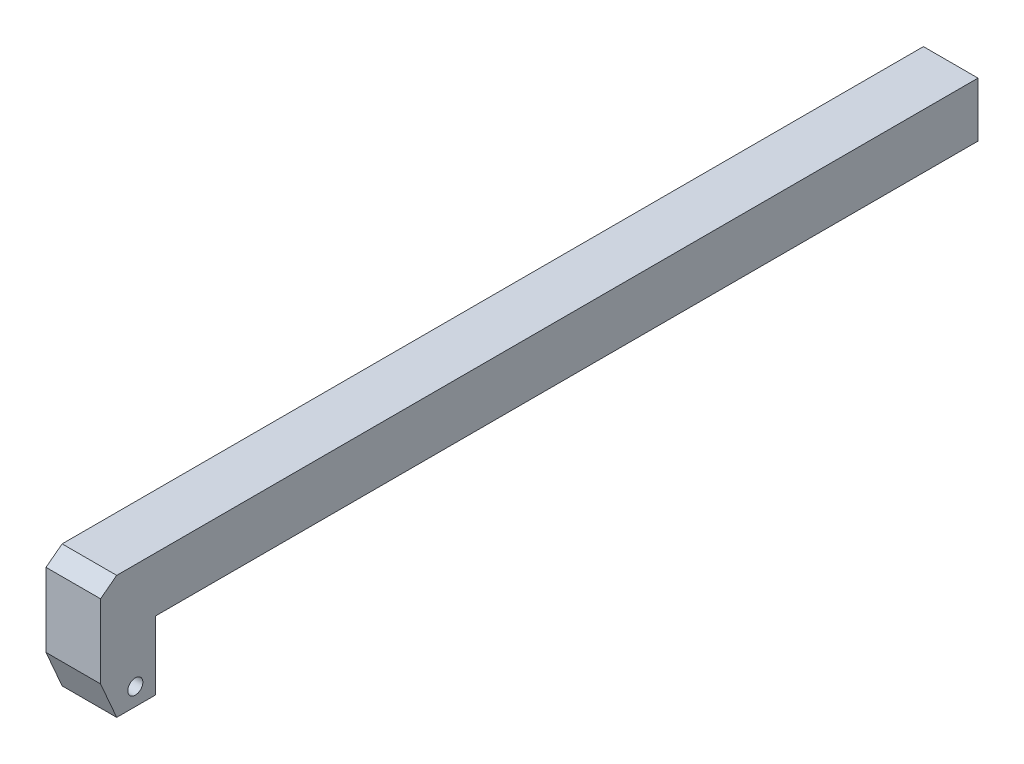
ISO-10303-21;
HEADER;
FILE_DESCRIPTION(('STEP AP214'),'2;1');
FILE_NAME('part.step','',(''),(''),'','','');
FILE_SCHEMA(('AUTOMOTIVE_DESIGN { 1 0 10303 214 1 1 1 1 }'));
ENDSEC;
DATA;
#1=APPLICATION_CONTEXT('core data for automotive mechanical design processes');
#2=APPLICATION_PROTOCOL_DEFINITION('international standard','automotive_design',2000,#1);
#3=PRODUCT_CONTEXT('',#1,'mechanical');
#4=PRODUCT('Part','Part','',(#3));
#5=PRODUCT_RELATED_PRODUCT_CATEGORY('part','',(#4));
#6=PRODUCT_DEFINITION_FORMATION('','',#4);
#7=PRODUCT_DEFINITION_CONTEXT('part definition',#1,'design');
#8=PRODUCT_DEFINITION('design','',#6,#7);
#9=PRODUCT_DEFINITION_SHAPE('','',#8);
#10=(LENGTH_UNIT() NAMED_UNIT(*) SI_UNIT(.MILLI.,.METRE.));
#11=(NAMED_UNIT(*) PLANE_ANGLE_UNIT() SI_UNIT($,.RADIAN.));
#12=(NAMED_UNIT(*) SI_UNIT($,.STERADIAN.) SOLID_ANGLE_UNIT());
#13=UNCERTAINTY_MEASURE_WITH_UNIT(LENGTH_MEASURE(1.E-05),#10,'distance_accuracy_value','');
#14=(GEOMETRIC_REPRESENTATION_CONTEXT(3) GLOBAL_UNCERTAINTY_ASSIGNED_CONTEXT((#13)) GLOBAL_UNIT_ASSIGNED_CONTEXT((#10,
#11,#12)) REPRESENTATION_CONTEXT('',''));
#15=CARTESIAN_POINT('',(0.,0.,0.));
#16=DIRECTION('',(0.,0.,1.));
#17=DIRECTION('',(1.,0.,0.));
#18=AXIS2_PLACEMENT_3D('',#15,#16,#17);
#19=CARTESIAN_POINT('',(0.,0.,11099.8));
#20=DIRECTION('',(1.,0.,0.));
#21=DIRECTION('',(0.,0.,-1.));
#22=AXIS2_PLACEMENT_3D('',#19,#20,#21);
#23=PLANE('',#22);
#24=DIRECTION('',(0.,-1.,0.));
#25=VECTOR('',#24,1.);
#26=CARTESIAN_POINT('',(0.,0.,0.));
#27=LINE('',#26,#25);
#28=CARTESIAN_POINT('',(0.,736.6,0.));
#29=VERTEX_POINT('',#28);
#30=CARTESIAN_POINT('',(0.,0.,0.));
#31=VERTEX_POINT('',#30);
#32=EDGE_CURVE('E115',#29,#31,#27,.T.);
#33=ORIENTED_EDGE('',*,*,#32,.T.);
#34=DIRECTION('',(0.,0.,-1.));
#35=VECTOR('',#34,1.);
#36=CARTESIAN_POINT('',(0.,0.,11099.8));
#37=LINE('',#36,#35);
#38=CARTESIAN_POINT('',(0.,0.,11099.8));
#39=VERTEX_POINT('',#38);
#40=EDGE_CURVE('E12',#39,#31,#37,.T.);
#41=ORIENTED_EDGE('',*,*,#40,.F.);
#42=DIRECTION('',(0.,1.,0.));
#43=VECTOR('',#42,1.);
#44=CARTESIAN_POINT('',(0.,-923.87759113299,11099.8));
#45=LINE('',#44,#43);
#46=CARTESIAN_POINT('',(0.,-923.87759113299,11099.8));
#47=VERTEX_POINT('',#46);
#48=EDGE_CURVE('E150',#47,#39,#45,.T.);
#49=ORIENTED_EDGE('',*,*,#48,.F.);
#50=DIRECTION('',(0.,0.,-1.));
#51=VECTOR('',#50,1.);
#52=CARTESIAN_POINT('',(0.,-923.87759113299,11625.8192032053));
#53=LINE('',#52,#51);
#54=CARTESIAN_POINT('',(0.,-923.87759113299,11625.8192032053));
#55=VERTEX_POINT('',#54);
#56=EDGE_CURVE('E135',#55,#47,#53,.T.);
#57=ORIENTED_EDGE('',*,*,#56,.F.);
#58=DIRECTION('',(0.,-0.916925737569036,-0.399057880242303));
#59=VECTOR('',#58,1.);
#60=CARTESIAN_POINT('',(0.,-423.598720109949,11843.5470056005));
#61=LINE('',#60,#59);
#62=CARTESIAN_POINT('',(0.,-423.598720109949,11843.5470056005));
#63=VERTEX_POINT('',#62);
#64=EDGE_CURVE('E140',#63,#55,#61,.T.);
#65=ORIENTED_EDGE('',*,*,#64,.F.);
#66=DIRECTION('',(0.,-1.,0.));
#67=VECTOR('',#66,1.);
#68=CARTESIAN_POINT('',(0.,571.270728239262,11843.5470056005));
#69=LINE('',#68,#67);
#70=CARTESIAN_POINT('',(0.,571.270728239262,11843.5470056005));
#71=VERTEX_POINT('',#70);
#72=EDGE_CURVE('E158',#71,#63,#69,.T.);
#73=ORIENTED_EDGE('',*,*,#72,.F.);
#74=DIRECTION('',(0.,-0.604749662713381,0.796415623558486));
#75=VECTOR('',#74,1.);
#76=CARTESIAN_POINT('',(0.,736.6,11625.8192032053));
#77=LINE('',#76,#75);
#78=CARTESIAN_POINT('',(0.,736.6,11625.8192032053));
#79=VERTEX_POINT('',#78);
#80=EDGE_CURVE('E126',#79,#71,#77,.T.);
#81=ORIENTED_EDGE('',*,*,#80,.F.);
#82=DIRECTION('',(0.,0.,-1.));
#83=VECTOR('',#82,1.);
#84=CARTESIAN_POINT('',(0.,736.6,11099.8));
#85=LINE('',#84,#83);
#86=EDGE_CURVE('E110',#79,#29,#85,.T.);
#87=ORIENTED_EDGE('',*,*,#86,.T.);
#88=EDGE_LOOP('',(#33,#41,#49,#57,#65,#73,#81,#87));
#89=FACE_BOUND('',#88,.T.);
#90=CARTESIAN_POINT('',(0.,-687.797576452867,11374.533737558));
#91=DIRECTION('',(1.,0.,0.));
#92=DIRECTION('',(0.,0.,-1.));
#93=AXIS2_PLACEMENT_3D('',#90,#91,#92);
#94=CIRCLE('',#93,101.599999999999);
#95=CARTESIAN_POINT('',(0.,-687.797576452867,11272.933737558));
#96=VERTEX_POINT('',#95);
#97=EDGE_CURVE('E173',#96,#96,#94,.T.);
#98=ORIENTED_EDGE('',*,*,#97,.T.);
#99=EDGE_LOOP('',(#98));
#100=FACE_BOUND('',#99,.T.);
#101=ADVANCED_FACE('F57',(#89,#100),#23,.F.);
#102=CARTESIAN_POINT('',(0.,0.,11099.8));
#103=DIRECTION('',(0.,1.,0.));
#104=DIRECTION('',(0.,0.,1.));
#105=AXIS2_PLACEMENT_3D('',#102,#103,#104);
#106=PLANE('',#105);
#107=DIRECTION('',(1.,0.,0.));
#108=VECTOR('',#107,1.);
#109=CARTESIAN_POINT('',(0.,0.,0.));
#110=LINE('',#109,#108);
#111=CARTESIAN_POINT('',(736.6,0.,0.));
#112=VERTEX_POINT('',#111);
#113=EDGE_CURVE('E101',#31,#112,#110,.T.);
#114=ORIENTED_EDGE('',*,*,#113,.T.);
#115=DIRECTION('',(0.,0.,-1.));
#116=VECTOR('',#115,1.);
#117=CARTESIAN_POINT('',(736.6,0.,11099.8));
#118=LINE('',#117,#116);
#119=CARTESIAN_POINT('',(736.6,0.,11099.8));
#120=VERTEX_POINT('',#119);
#121=EDGE_CURVE('E65',#120,#112,#118,.T.);
#122=ORIENTED_EDGE('',*,*,#121,.F.);
#123=DIRECTION('',(1.,0.,0.));
#124=VECTOR('',#123,1.);
#125=CARTESIAN_POINT('',(0.,0.,11099.8));
#126=LINE('',#125,#124);
#127=EDGE_CURVE('E71',#39,#120,#126,.T.);
#128=ORIENTED_EDGE('',*,*,#127,.F.);
#129=ORIENTED_EDGE('',*,*,#40,.T.);
#130=EDGE_LOOP('',(#114,#122,#128,#129));
#131=FACE_BOUND('',#130,.T.);
#132=ADVANCED_FACE('F145',(#131),#106,.F.);
#133=CARTESIAN_POINT('',(736.6,0.,11099.8));
#134=DIRECTION('',(-1.,0.,0.));
#135=DIRECTION('',(0.,0.,1.));
#136=AXIS2_PLACEMENT_3D('',#133,#134,#135);
#137=PLANE('',#136);
#138=DIRECTION('',(0.,1.,0.));
#139=VECTOR('',#138,1.);
#140=CARTESIAN_POINT('',(736.6,0.,0.));
#141=LINE('',#140,#139);
#142=CARTESIAN_POINT('',(736.6,736.6,0.));
#143=VERTEX_POINT('',#142);
#144=EDGE_CURVE('E89',#112,#143,#141,.T.);
#145=ORIENTED_EDGE('',*,*,#144,.T.);
#146=DIRECTION('',(0.,0.,-1.));
#147=VECTOR('',#146,1.);
#148=CARTESIAN_POINT('',(736.6,736.6,11099.8));
#149=LINE('',#148,#147);
#150=CARTESIAN_POINT('',(736.6,736.6,11625.8192032053));
#151=VERTEX_POINT('',#150);
#152=EDGE_CURVE('E95',#151,#143,#149,.T.);
#153=ORIENTED_EDGE('',*,*,#152,.F.);
#154=DIRECTION('',(0.,-0.604749662713381,0.796415623558486));
#155=VECTOR('',#154,1.);
#156=CARTESIAN_POINT('',(736.6,736.6,11625.8192032053));
#157=LINE('',#156,#155);
#158=CARTESIAN_POINT('',(736.6,571.270728239262,11843.5470056005));
#159=VERTEX_POINT('',#158);
#160=EDGE_CURVE('E133',#151,#159,#157,.T.);
#161=ORIENTED_EDGE('',*,*,#160,.T.);
#162=DIRECTION('',(0.,-1.,0.));
#163=VECTOR('',#162,1.);
#164=CARTESIAN_POINT('',(736.6,571.270728239262,11843.5470056005));
#165=LINE('',#164,#163);
#166=CARTESIAN_POINT('',(736.6,-423.598720109949,11843.5470056005));
#167=VERTEX_POINT('',#166);
#168=EDGE_CURVE('E175',#159,#167,#165,.T.);
#169=ORIENTED_EDGE('',*,*,#168,.T.);
#170=DIRECTION('',(0.,-0.916925737569036,-0.399057880242303));
#171=VECTOR('',#170,1.);
#172=CARTESIAN_POINT('',(736.6,-423.598720109949,11843.5470056005));
#173=LINE('',#172,#171);
#174=CARTESIAN_POINT('',(736.6,-923.87759113299,11625.8192032053));
#175=VERTEX_POINT('',#174);
#176=EDGE_CURVE('E161',#167,#175,#173,.T.);
#177=ORIENTED_EDGE('',*,*,#176,.T.);
#178=DIRECTION('',(0.,0.,-1.));
#179=VECTOR('',#178,1.);
#180=CARTESIAN_POINT('',(736.6,-923.87759113299,11625.8192032053));
#181=LINE('',#180,#179);
#182=CARTESIAN_POINT('',(736.6,-923.87759113299,11099.8));
#183=VERTEX_POINT('',#182);
#184=EDGE_CURVE('E156',#175,#183,#181,.T.);
#185=ORIENTED_EDGE('',*,*,#184,.T.);
#186=DIRECTION('',(0.,1.,0.));
#187=VECTOR('',#186,1.);
#188=CARTESIAN_POINT('',(736.6,0.,11099.8));
#189=LINE('',#188,#187);
#190=EDGE_CURVE('E171',#183,#120,#189,.T.);
#191=ORIENTED_EDGE('',*,*,#190,.T.);
#192=ORIENTED_EDGE('',*,*,#121,.T.);
#193=EDGE_LOOP('',(#145,#153,#161,#169,#177,#185,#191,#192));
#194=FACE_BOUND('',#193,.T.);
#195=CARTESIAN_POINT('',(736.6,-687.797576452867,11374.533737558));
#196=DIRECTION('',(1.,0.,0.));
#197=DIRECTION('',(0.,0.,-1.));
#198=AXIS2_PLACEMENT_3D('',#195,#196,#197);
#199=CIRCLE('',#198,101.599999999999);
#200=CARTESIAN_POINT('',(736.6,-687.797576452867,11272.933737558));
#201=VERTEX_POINT('',#200);
#202=EDGE_CURVE('E164',#201,#201,#199,.T.);
#203=ORIENTED_EDGE('',*,*,#202,.F.);
#204=EDGE_LOOP('',(#203));
#205=FACE_BOUND('',#204,.T.);
#206=ADVANCED_FACE('F91',(#194,#205),#137,.F.);
#207=CARTESIAN_POINT('',(0.,736.6,11099.8));
#208=DIRECTION('',(0.,-1.,0.));
#209=DIRECTION('',(0.,0.,-1.));
#210=AXIS2_PLACEMENT_3D('',#207,#208,#209);
#211=PLANE('',#210);
#212=DIRECTION('',(-1.,0.,0.));
#213=VECTOR('',#212,1.);
#214=CARTESIAN_POINT('',(0.,736.6,0.));
#215=LINE('',#214,#213);
#216=EDGE_CURVE('E100',#143,#29,#215,.T.);
#217=ORIENTED_EDGE('',*,*,#216,.T.);
#218=ORIENTED_EDGE('',*,*,#86,.F.);
#219=DIRECTION('',(1.,0.,0.));
#220=VECTOR('',#219,1.);
#221=CARTESIAN_POINT('',(0.,736.6,11625.8192032053));
#222=LINE('',#221,#220);
#223=EDGE_CURVE('E108',#79,#151,#222,.T.);
#224=ORIENTED_EDGE('',*,*,#223,.T.);
#225=ORIENTED_EDGE('',*,*,#152,.T.);
#226=EDGE_LOOP('',(#217,#218,#224,#225));
#227=FACE_BOUND('',#226,.T.);
#228=ADVANCED_FACE('F104',(#227),#211,.F.);
#229=CARTESIAN_POINT('',(0.,0.,0.));
#230=DIRECTION('',(0.,0.,-1.));
#231=DIRECTION('',(-1.,0.,0.));
#232=AXIS2_PLACEMENT_3D('',#229,#230,#231);
#233=PLANE('',#232);
#234=ORIENTED_EDGE('',*,*,#32,.F.);
#235=ORIENTED_EDGE('',*,*,#216,.F.);
#236=ORIENTED_EDGE('',*,*,#144,.F.);
#237=ORIENTED_EDGE('',*,*,#113,.F.);
#238=EDGE_LOOP('',(#234,#235,#236,#237));
#239=FACE_BOUND('',#238,.T.);
#240=ADVANCED_FACE('F113',(#239),#233,.T.);
#241=CARTESIAN_POINT('',(0.,-923.87759113299,11625.8192032053));
#242=DIRECTION('',(0.,-1.,0.));
#243=DIRECTION('',(0.,0.,-1.));
#244=AXIS2_PLACEMENT_3D('',#241,#242,#243);
#245=PLANE('',#244);
#246=ORIENTED_EDGE('',*,*,#184,.F.);
#247=DIRECTION('',(1.,0.,0.));
#248=VECTOR('',#247,1.);
#249=CARTESIAN_POINT('',(0.,-923.87759113299,11625.8192032053));
#250=LINE('',#249,#248);
#251=EDGE_CURVE('E181',#55,#175,#250,.T.);
#252=ORIENTED_EDGE('',*,*,#251,.F.);
#253=ORIENTED_EDGE('',*,*,#56,.T.);
#254=DIRECTION('',(1.,0.,0.));
#255=VECTOR('',#254,1.);
#256=CARTESIAN_POINT('',(0.,-923.87759113299,11099.8));
#257=LINE('',#256,#255);
#258=EDGE_CURVE('E144',#47,#183,#257,.T.);
#259=ORIENTED_EDGE('',*,*,#258,.T.);
#260=EDGE_LOOP('',(#246,#252,#253,#259));
#261=FACE_BOUND('',#260,.T.);
#262=ADVANCED_FACE('F205',(#261),#245,.T.);
#263=CARTESIAN_POINT('',(0.,-423.598720109949,11843.5470056005));
#264=DIRECTION('',(0.,-0.399057880242303,0.916925737569035));
#265=DIRECTION('',(0.,-0.916925737569036,-0.399057880242303));
#266=AXIS2_PLACEMENT_3D('',#263,#264,#265);
#267=PLANE('',#266);
#268=ORIENTED_EDGE('',*,*,#176,.F.);
#269=DIRECTION('',(1.,0.,0.));
#270=VECTOR('',#269,1.);
#271=CARTESIAN_POINT('',(0.,-423.598720109949,11843.5470056005));
#272=LINE('',#271,#270);
#273=EDGE_CURVE('E137',#63,#167,#272,.T.);
#274=ORIENTED_EDGE('',*,*,#273,.F.);
#275=ORIENTED_EDGE('',*,*,#64,.T.);
#276=ORIENTED_EDGE('',*,*,#251,.T.);
#277=EDGE_LOOP('',(#268,#274,#275,#276));
#278=FACE_BOUND('',#277,.T.);
#279=ADVANCED_FACE('F197',(#278),#267,.T.);
#280=CARTESIAN_POINT('',(0.,571.270728239262,11843.5470056005));
#281=DIRECTION('',(0.,0.,1.));
#282=DIRECTION('',(1.,0.,0.));
#283=AXIS2_PLACEMENT_3D('',#280,#281,#282);
#284=PLANE('',#283);
#285=ORIENTED_EDGE('',*,*,#168,.F.);
#286=DIRECTION('',(1.,0.,0.));
#287=VECTOR('',#286,1.);
#288=CARTESIAN_POINT('',(0.,571.270728239262,11843.5470056005));
#289=LINE('',#288,#287);
#290=EDGE_CURVE('E134',#71,#159,#289,.T.);
#291=ORIENTED_EDGE('',*,*,#290,.F.);
#292=ORIENTED_EDGE('',*,*,#72,.T.);
#293=ORIENTED_EDGE('',*,*,#273,.T.);
#294=EDGE_LOOP('',(#285,#291,#292,#293));
#295=FACE_BOUND('',#294,.T.);
#296=ADVANCED_FACE('F189',(#295),#284,.T.);
#297=CARTESIAN_POINT('',(0.,736.6,11625.8192032053));
#298=DIRECTION('',(0.,0.796415623558486,0.604749662713381));
#299=DIRECTION('',(0.,-0.604749662713381,0.796415623558486));
#300=AXIS2_PLACEMENT_3D('',#297,#298,#299);
#301=PLANE('',#300);
#302=ORIENTED_EDGE('',*,*,#160,.F.);
#303=ORIENTED_EDGE('',*,*,#223,.F.);
#304=ORIENTED_EDGE('',*,*,#80,.T.);
#305=ORIENTED_EDGE('',*,*,#290,.T.);
#306=EDGE_LOOP('',(#302,#303,#304,#305));
#307=FACE_BOUND('',#306,.T.);
#308=ADVANCED_FACE('F131',(#307),#301,.T.);
#309=CARTESIAN_POINT('',(0.,0.,11099.8));
#310=DIRECTION('',(0.,0.,-1.));
#311=DIRECTION('',(-1.,0.,0.));
#312=AXIS2_PLACEMENT_3D('',#309,#310,#311);
#313=PLANE('',#312);
#314=ORIENTED_EDGE('',*,*,#48,.T.);
#315=ORIENTED_EDGE('',*,*,#127,.T.);
#316=ORIENTED_EDGE('',*,*,#190,.F.);
#317=ORIENTED_EDGE('',*,*,#258,.F.);
#318=EDGE_LOOP('',(#314,#315,#316,#317));
#319=FACE_BOUND('',#318,.T.);
#320=ADVANCED_FACE('F153',(#319),#313,.T.);
#321=CARTESIAN_POINT('',(0.,-687.797576452867,11374.533737558));
#322=DIRECTION('',(1.,0.,0.));
#323=DIRECTION('',(0.,0.,-1.));
#324=AXIS2_PLACEMENT_3D('',#321,#322,#323);
#325=CYLINDRICAL_SURFACE('',#324,101.599999999999);
#326=ORIENTED_EDGE('',*,*,#97,.F.);
#327=EDGE_LOOP('',(#326));
#328=FACE_BOUND('',#327,.T.);
#329=ORIENTED_EDGE('',*,*,#202,.T.);
#330=EDGE_LOOP('',(#329));
#331=FACE_BOUND('',#330,.T.);
#332=ADVANCED_FACE('F232',(#328,#331),#325,.F.);
#333=CLOSED_SHELL('',(#101,#132,#206,#228,#240,#262,#279,#296,#308,#320,#332));
#334=MANIFOLD_SOLID_BREP('B2',#333);
#335=ADVANCED_BREP_SHAPE_REPRESENTATION('',(#18,#334),#14);
#336=SHAPE_DEFINITION_REPRESENTATION(#9,#335);
ENDSEC;
END-ISO-10303-21;
